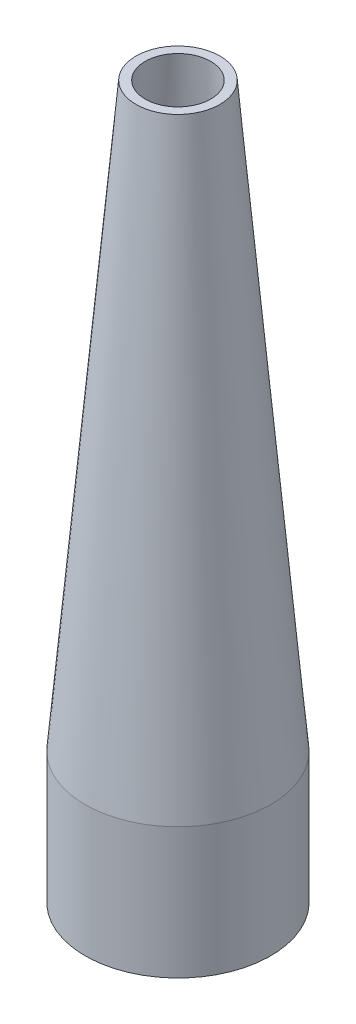
ISO-10303-21;
HEADER;
FILE_DESCRIPTION(('STEP AP214'),'2;1');
FILE_NAME('part.step','',(''),(''),'','','');
FILE_SCHEMA(('AUTOMOTIVE_DESIGN { 1 0 10303 214 1 1 1 1 }'));
ENDSEC;
DATA;
#1=APPLICATION_CONTEXT('core data for automotive mechanical design processes');
#2=APPLICATION_PROTOCOL_DEFINITION('international standard','automotive_design',2000,#1);
#3=PRODUCT_CONTEXT('',#1,'mechanical');
#4=PRODUCT('Part','Part','',(#3));
#5=PRODUCT_RELATED_PRODUCT_CATEGORY('part','',(#4));
#6=PRODUCT_DEFINITION_FORMATION('','',#4);
#7=PRODUCT_DEFINITION_CONTEXT('part definition',#1,'design');
#8=PRODUCT_DEFINITION('design','',#6,#7);
#9=PRODUCT_DEFINITION_SHAPE('','',#8);
#10=(LENGTH_UNIT() NAMED_UNIT(*) SI_UNIT(.MILLI.,.METRE.));
#11=(NAMED_UNIT(*) PLANE_ANGLE_UNIT() SI_UNIT($,.RADIAN.));
#12=(NAMED_UNIT(*) SI_UNIT($,.STERADIAN.) SOLID_ANGLE_UNIT());
#13=UNCERTAINTY_MEASURE_WITH_UNIT(LENGTH_MEASURE(1.E-05),#10,'distance_accuracy_value','');
#14=(GEOMETRIC_REPRESENTATION_CONTEXT(3) GLOBAL_UNCERTAINTY_ASSIGNED_CONTEXT((#13)) GLOBAL_UNIT_ASSIGNED_CONTEXT((#10,
#11,#12)) REPRESENTATION_CONTEXT('',''));
#15=CARTESIAN_POINT('',(0.,0.,0.));
#16=DIRECTION('',(0.,0.,1.));
#17=DIRECTION('',(1.,0.,0.));
#18=AXIS2_PLACEMENT_3D('',#15,#16,#17);
#19=CARTESIAN_POINT('',(0.,0.,0.));
#20=DIRECTION('',(0.,-1.,0.));
#21=DIRECTION('',(0.,0.,-1.));
#22=AXIS2_PLACEMENT_3D('',#19,#20,#21);
#23=CYLINDRICAL_SURFACE('',#22,26.9875);
#24=CARTESIAN_POINT('',(0.,-157.933443479731,0.));
#25=DIRECTION('',(0.,-1.,0.));
#26=DIRECTION('',(0.,0.,-1.));
#27=AXIS2_PLACEMENT_3D('',#24,#25,#26);
#28=CIRCLE('',#27,26.9875);
#29=CARTESIAN_POINT('',(0.,-157.933443479731,-26.9875));
#30=VERTEX_POINT('',#29);
#31=EDGE_CURVE('E67',#30,#30,#28,.T.);
#32=ORIENTED_EDGE('',*,*,#31,.F.);
#33=EDGE_LOOP('',(#32));
#34=FACE_BOUND('',#33,.T.);
#35=CARTESIAN_POINT('',(0.,-119.833443479731,0.));
#36=DIRECTION('',(0.,-1.,0.));
#37=DIRECTION('',(0.,0.,-1.));
#38=AXIS2_PLACEMENT_3D('',#35,#36,#37);
#39=CIRCLE('',#38,26.9875);
#40=CARTESIAN_POINT('',(0.,-119.833443479731,-26.9875));
#41=VERTEX_POINT('',#40);
#42=EDGE_CURVE('E10',#41,#41,#39,.T.);
#43=ORIENTED_EDGE('',*,*,#42,.T.);
#44=EDGE_LOOP('',(#43));
#45=FACE_BOUND('',#44,.T.);
#46=ADVANCED_FACE('F45',(#34,#45),#23,.T.);
#47=CARTESIAN_POINT('',(0.,49.1634516310501,0.));
#48=DIRECTION('',(0.,-1.,0.));
#49=DIRECTION('',(0.,0.,-1.));
#50=AXIS2_PLACEMENT_3D('',#47,#48,#49);
#51=CONICAL_SURFACE('',#50,12.2021875067281,0.0872664625997099);
#52=ORIENTED_EDGE('',*,*,#42,.F.);
#53=EDGE_LOOP('',(#52));
#54=FACE_BOUND('',#53,.T.);
#55=CARTESIAN_POINT('',(0.,49.1634516310501,0.));
#56=DIRECTION('',(0.,-1.,0.));
#57=DIRECTION('',(0.,0.,-1.));
#58=AXIS2_PLACEMENT_3D('',#55,#56,#57);
#59=CIRCLE('',#58,12.2021875067281);
#60=CARTESIAN_POINT('',(0.,49.1634516310501,-12.2021875067281));
#61=VERTEX_POINT('',#60);
#62=EDGE_CURVE('E51',#61,#61,#59,.T.);
#63=ORIENTED_EDGE('',*,*,#62,.T.);
#64=EDGE_LOOP('',(#63));
#65=FACE_BOUND('',#64,.T.);
#66=ADVANCED_FACE('F75',(#54,#65),#51,.T.);
#67=CARTESIAN_POINT('',(0.,49.1634516310501,0.));
#68=DIRECTION('',(0.,-1.,0.));
#69=DIRECTION('',(0.,0.,-1.));
#70=AXIS2_PLACEMENT_3D('',#67,#68,#69);
#71=PLANE('',#70);
#72=ORIENTED_EDGE('',*,*,#62,.F.);
#73=EDGE_LOOP('',(#72));
#74=FACE_BOUND('',#73,.T.);
#75=CARTESIAN_POINT('',(0.,49.1634516310501,0.));
#76=DIRECTION('',(0.,-1.,0.));
#77=DIRECTION('',(0.,0.,-1.));
#78=AXIS2_PLACEMENT_3D('',#75,#76,#77);
#79=CIRCLE('',#78,9.525);
#80=CARTESIAN_POINT('',(0.,49.1634516310501,-9.525));
#81=VERTEX_POINT('',#80);
#82=EDGE_CURVE('E55',#81,#81,#79,.T.);
#83=ORIENTED_EDGE('',*,*,#82,.T.);
#84=EDGE_LOOP('',(#83));
#85=FACE_BOUND('',#84,.T.);
#86=ADVANCED_FACE('F79',(#74,#85),#71,.F.);
#87=CARTESIAN_POINT('',(0.,-119.833443479731,0.));
#88=DIRECTION('',(0.,-1.,0.));
#89=DIRECTION('',(0.,0.,-1.));
#90=AXIS2_PLACEMENT_3D('',#87,#88,#89);
#91=CONICAL_SURFACE('',#90,24.3103124932719,0.0872664625997098);
#92=ORIENTED_EDGE('',*,*,#82,.F.);
#93=EDGE_LOOP('',(#92));
#94=FACE_BOUND('',#93,.T.);
#95=CARTESIAN_POINT('',(0.,-119.833443479731,0.));
#96=DIRECTION('',(0.,-1.,0.));
#97=DIRECTION('',(0.,0.,-1.));
#98=AXIS2_PLACEMENT_3D('',#95,#96,#97);
#99=CIRCLE('',#98,24.3103124932719);
#100=CARTESIAN_POINT('',(0.,-119.833443479731,-24.3103124932719));
#101=VERTEX_POINT('',#100);
#102=EDGE_CURVE('E59',#101,#101,#99,.T.);
#103=ORIENTED_EDGE('',*,*,#102,.T.);
#104=EDGE_LOOP('',(#103));
#105=FACE_BOUND('',#104,.T.);
#106=ADVANCED_FACE('F84',(#94,#105),#91,.F.);
#107=CARTESIAN_POINT('',(0.,0.,0.));
#108=DIRECTION('',(0.,-1.,0.));
#109=DIRECTION('',(0.,0.,-1.));
#110=AXIS2_PLACEMENT_3D('',#107,#108,#109);
#111=CYLINDRICAL_SURFACE('',#110,24.3103124932719);
#112=CARTESIAN_POINT('',(0.,-157.933443479731,0.));
#113=DIRECTION('',(0.,-1.,0.));
#114=DIRECTION('',(0.,0.,-1.));
#115=AXIS2_PLACEMENT_3D('',#112,#113,#114);
#116=CIRCLE('',#115,24.3103124932719);
#117=CARTESIAN_POINT('',(0.,-157.933443479731,-24.3103124932719));
#118=VERTEX_POINT('',#117);
#119=EDGE_CURVE('E64',#118,#118,#116,.T.);
#120=ORIENTED_EDGE('',*,*,#119,.T.);
#121=EDGE_LOOP('',(#120));
#122=FACE_BOUND('',#121,.T.);
#123=ORIENTED_EDGE('',*,*,#102,.F.);
#124=EDGE_LOOP('',(#123));
#125=FACE_BOUND('',#124,.T.);
#126=ADVANCED_FACE('F90',(#122,#125),#111,.F.);
#127=CARTESIAN_POINT('',(0.,-157.933443479731,0.));
#128=DIRECTION('',(0.,-1.,0.));
#129=DIRECTION('',(0.,0.,-1.));
#130=AXIS2_PLACEMENT_3D('',#127,#128,#129);
#131=PLANE('',#130);
#132=ORIENTED_EDGE('',*,*,#31,.T.);
#133=EDGE_LOOP('',(#132));
#134=FACE_BOUND('',#133,.T.);
#135=ORIENTED_EDGE('',*,*,#119,.F.);
#136=EDGE_LOOP('',(#135));
#137=FACE_BOUND('',#136,.T.);
#138=ADVANCED_FACE('F71',(#134,#137),#131,.T.);
#139=CLOSED_SHELL('',(#46,#66,#86,#106,#126,#138));
#140=MANIFOLD_SOLID_BREP('B2',#139);
#141=ADVANCED_BREP_SHAPE_REPRESENTATION('',(#18,#140),#14);
#142=SHAPE_DEFINITION_REPRESENTATION(#9,#141);
ENDSEC;
END-ISO-10303-21;
